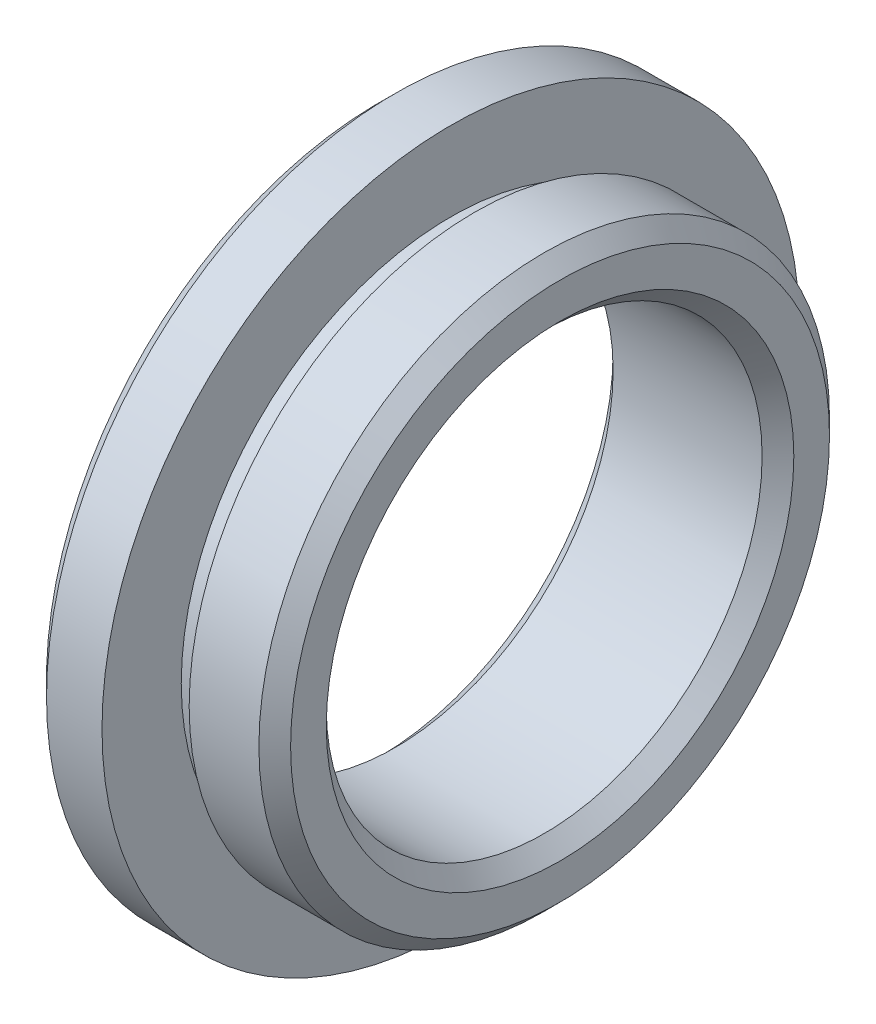
ISO-10303-21;
HEADER;
FILE_DESCRIPTION(('STEP AP214'),'2;1');
FILE_NAME('part.step','',(''),(''),'','','');
FILE_SCHEMA(('AUTOMOTIVE_DESIGN { 1 0 10303 214 1 1 1 1 }'));
ENDSEC;
DATA;
#1=APPLICATION_CONTEXT('core data for automotive mechanical design processes');
#2=APPLICATION_PROTOCOL_DEFINITION('international standard','automotive_design',2000,#1);
#3=PRODUCT_CONTEXT('',#1,'mechanical');
#4=PRODUCT('Part','Part','',(#3));
#5=PRODUCT_RELATED_PRODUCT_CATEGORY('part','',(#4));
#6=PRODUCT_DEFINITION_FORMATION('','',#4);
#7=PRODUCT_DEFINITION_CONTEXT('part definition',#1,'design');
#8=PRODUCT_DEFINITION('design','',#6,#7);
#9=PRODUCT_DEFINITION_SHAPE('','',#8);
#10=(LENGTH_UNIT() NAMED_UNIT(*) SI_UNIT(.MILLI.,.METRE.));
#11=(NAMED_UNIT(*) PLANE_ANGLE_UNIT() SI_UNIT($,.RADIAN.));
#12=(NAMED_UNIT(*) SI_UNIT($,.STERADIAN.) SOLID_ANGLE_UNIT());
#13=UNCERTAINTY_MEASURE_WITH_UNIT(LENGTH_MEASURE(1.E-05),#10,'distance_accuracy_value','');
#14=(GEOMETRIC_REPRESENTATION_CONTEXT(3) GLOBAL_UNCERTAINTY_ASSIGNED_CONTEXT((#13)) GLOBAL_UNIT_ASSIGNED_CONTEXT((#10,
#11,#12)) REPRESENTATION_CONTEXT('',''));
#15=CARTESIAN_POINT('',(0.,0.,0.));
#16=DIRECTION('',(0.,0.,1.));
#17=DIRECTION('',(1.,0.,0.));
#18=AXIS2_PLACEMENT_3D('',#15,#16,#17);
#19=CARTESIAN_POINT('',(0.,0.,0.));
#20=DIRECTION('',(-1.,0.,0.));
#21=DIRECTION('',(0.,0.,1.));
#22=AXIS2_PLACEMENT_3D('',#19,#20,#21);
#23=CYLINDRICAL_SURFACE('',#22,13.75);
#24=CARTESIAN_POINT('',(1.00000000000001,0.,0.));
#25=DIRECTION('',(1.,0.,0.));
#26=DIRECTION('',(0.,0.,-1.));
#27=AXIS2_PLACEMENT_3D('',#24,#25,#26);
#28=CIRCLE('',#27,13.75);
#29=CARTESIAN_POINT('',(1.00000000000001,0.,-13.75));
#30=VERTEX_POINT('',#29);
#31=EDGE_CURVE('E79',#30,#30,#28,.F.);
#32=ORIENTED_EDGE('',*,*,#31,.T.);
#33=EDGE_LOOP('',(#32));
#34=FACE_BOUND('',#33,.T.);
#35=CARTESIAN_POINT('',(10.4,0.,0.));
#36=DIRECTION('',(-1.,0.,0.));
#37=DIRECTION('',(0.,0.,1.));
#38=AXIS2_PLACEMENT_3D('',#35,#36,#37);
#39=CIRCLE('',#38,13.75);
#40=CARTESIAN_POINT('',(10.4,0.,13.75));
#41=VERTEX_POINT('',#40);
#42=EDGE_CURVE('E76',#41,#41,#39,.F.);
#43=ORIENTED_EDGE('',*,*,#42,.T.);
#44=EDGE_LOOP('',(#43));
#45=FACE_BOUND('',#44,.T.);
#46=ADVANCED_FACE('F31',(#34,#45),#23,.F.);
#47=CARTESIAN_POINT('',(0.,13.75,0.));
#48=DIRECTION('',(1.,0.,0.));
#49=DIRECTION('',(0.,0.,-1.));
#50=AXIS2_PLACEMENT_3D('',#47,#48,#49);
#51=PLANE('',#50);
#52=CARTESIAN_POINT('',(0.,-18.5,0.));
#53=DIRECTION('',(-1.,0.,0.));
#54=DIRECTION('',(0.,0.,1.));
#55=AXIS2_PLACEMENT_3D('',#52,#53,#54);
#56=CIRCLE('',#55,1.55);
#57=CARTESIAN_POINT('',(0.,-18.5,1.55));
#58=VERTEX_POINT('',#57);
#59=EDGE_CURVE('E53',#58,#58,#56,.T.);
#60=ORIENTED_EDGE('',*,*,#59,.F.);
#61=EDGE_LOOP('',(#60));
#62=FACE_BOUND('',#61,.T.);
#63=CARTESIAN_POINT('',(0.,18.5,0.));
#64=DIRECTION('',(-1.,0.,0.));
#65=DIRECTION('',(0.,0.,1.));
#66=AXIS2_PLACEMENT_3D('',#63,#64,#65);
#67=CIRCLE('',#66,1.55);
#68=CARTESIAN_POINT('',(0.,18.5,1.55));
#69=VERTEX_POINT('',#68);
#70=EDGE_CURVE('E61',#69,#69,#67,.T.);
#71=ORIENTED_EDGE('',*,*,#70,.F.);
#72=EDGE_LOOP('',(#71));
#73=FACE_BOUND('',#72,.T.);
#74=CARTESIAN_POINT('',(0.,0.,0.));
#75=DIRECTION('',(1.,0.,0.));
#76=DIRECTION('',(0.,0.,-1.));
#77=AXIS2_PLACEMENT_3D('',#74,#75,#76);
#78=CIRCLE('',#77,14.75);
#79=CARTESIAN_POINT('',(0.,0.,-14.75));
#80=VERTEX_POINT('',#79);
#81=EDGE_CURVE('E85',#80,#80,#78,.T.);
#82=ORIENTED_EDGE('',*,*,#81,.T.);
#83=EDGE_LOOP('',(#82));
#84=FACE_BOUND('',#83,.T.);
#85=CARTESIAN_POINT('',(0.,0.,0.));
#86=DIRECTION('',(1.,0.,0.));
#87=DIRECTION('',(0.,0.,-1.));
#88=AXIS2_PLACEMENT_3D('',#85,#86,#87);
#89=CIRCLE('',#88,21.);
#90=CARTESIAN_POINT('',(0.,0.,-21.));
#91=VERTEX_POINT('',#90);
#92=EDGE_CURVE('E82',#91,#91,#89,.F.);
#93=ORIENTED_EDGE('',*,*,#92,.T.);
#94=EDGE_LOOP('',(#93));
#95=FACE_BOUND('',#94,.T.);
#96=ADVANCED_FACE('F107',(#62,#73,#84,#95),#51,.F.);
#97=CARTESIAN_POINT('',(0.,0.,0.));
#98=DIRECTION('',(-1.,0.,0.));
#99=DIRECTION('',(0.,0.,1.));
#100=AXIS2_PLACEMENT_3D('',#97,#98,#99);
#101=CYLINDRICAL_SURFACE('',#100,22.);
#102=CARTESIAN_POINT('',(1.,0.,0.));
#103=DIRECTION('',(1.,0.,0.));
#104=DIRECTION('',(0.,0.,-1.));
#105=AXIS2_PLACEMENT_3D('',#102,#103,#104);
#106=CIRCLE('',#105,22.);
#107=CARTESIAN_POINT('',(1.,0.,-22.));
#108=VERTEX_POINT('',#107);
#109=EDGE_CURVE('E38',#108,#108,#106,.T.);
#110=ORIENTED_EDGE('',*,*,#109,.T.);
#111=EDGE_LOOP('',(#110));
#112=FACE_BOUND('',#111,.T.);
#113=CARTESIAN_POINT('',(4.5,0.,0.));
#114=DIRECTION('',(-1.,0.,0.));
#115=DIRECTION('',(0.,0.,1.));
#116=AXIS2_PLACEMENT_3D('',#113,#114,#115);
#117=CIRCLE('',#116,22.);
#118=CARTESIAN_POINT('',(4.5,0.,22.));
#119=VERTEX_POINT('',#118);
#120=EDGE_CURVE('E73',#119,#119,#117,.T.);
#121=ORIENTED_EDGE('',*,*,#120,.T.);
#122=EDGE_LOOP('',(#121));
#123=FACE_BOUND('',#122,.T.);
#124=ADVANCED_FACE('F96',(#112,#123),#101,.T.);
#125=CARTESIAN_POINT('',(4.5,22.,0.));
#126=DIRECTION('',(-1.,0.,0.));
#127=DIRECTION('',(0.,0.,1.));
#128=AXIS2_PLACEMENT_3D('',#125,#126,#127);
#129=PLANE('',#128);
#130=ORIENTED_EDGE('',*,*,#120,.F.);
#131=EDGE_LOOP('',(#130));
#132=FACE_BOUND('',#131,.T.);
#133=CARTESIAN_POINT('',(4.5,0.,0.));
#134=DIRECTION('',(-1.,0.,0.));
#135=DIRECTION('',(0.,0.,1.));
#136=AXIS2_PLACEMENT_3D('',#133,#134,#135);
#137=CIRCLE('',#136,17.);
#138=CARTESIAN_POINT('',(4.5,0.,17.));
#139=VERTEX_POINT('',#138);
#140=EDGE_CURVE('E70',#139,#139,#137,.T.);
#141=ORIENTED_EDGE('',*,*,#140,.T.);
#142=EDGE_LOOP('',(#141));
#143=FACE_BOUND('',#142,.T.);
#144=ADVANCED_FACE('F114',(#132,#143),#129,.F.);
#145=CARTESIAN_POINT('',(0.,0.,0.));
#146=DIRECTION('',(-1.,0.,0.));
#147=DIRECTION('',(0.,0.,1.));
#148=AXIS2_PLACEMENT_3D('',#145,#146,#147);
#149=CYLINDRICAL_SURFACE('',#148,17.);
#150=ORIENTED_EDGE('',*,*,#140,.F.);
#151=EDGE_LOOP('',(#150));
#152=FACE_BOUND('',#151,.T.);
#153=CARTESIAN_POINT('',(6.,0.,0.));
#154=DIRECTION('',(-1.,0.,0.));
#155=DIRECTION('',(0.,0.,1.));
#156=AXIS2_PLACEMENT_3D('',#153,#154,#155);
#157=CIRCLE('',#156,17.);
#158=CARTESIAN_POINT('',(6.,0.,17.));
#159=VERTEX_POINT('',#158);
#160=EDGE_CURVE('E67',#159,#159,#157,.T.);
#161=ORIENTED_EDGE('',*,*,#160,.T.);
#162=EDGE_LOOP('',(#161));
#163=FACE_BOUND('',#162,.T.);
#164=ADVANCED_FACE('F122',(#152,#163),#149,.T.);
#165=CARTESIAN_POINT('',(6.,17.,0.));
#166=DIRECTION('',(1.,0.,0.));
#167=DIRECTION('',(0.,0.,-1.));
#168=AXIS2_PLACEMENT_3D('',#165,#166,#167);
#169=PLANE('',#168);
#170=ORIENTED_EDGE('',*,*,#160,.F.);
#171=EDGE_LOOP('',(#170));
#172=FACE_BOUND('',#171,.T.);
#173=CARTESIAN_POINT('',(6.,0.,0.));
#174=DIRECTION('',(-1.,0.,0.));
#175=DIRECTION('',(0.,0.,1.));
#176=AXIS2_PLACEMENT_3D('',#173,#174,#175);
#177=CIRCLE('',#176,18.);
#178=CARTESIAN_POINT('',(6.,0.,18.));
#179=VERTEX_POINT('',#178);
#180=EDGE_CURVE('E64',#179,#179,#177,.T.);
#181=ORIENTED_EDGE('',*,*,#180,.T.);
#182=EDGE_LOOP('',(#181));
#183=FACE_BOUND('',#182,.T.);
#184=ADVANCED_FACE('F126',(#172,#183),#169,.F.);
#185=CARTESIAN_POINT('',(0.,0.,0.));
#186=DIRECTION('',(-1.,0.,0.));
#187=DIRECTION('',(0.,0.,1.));
#188=AXIS2_PLACEMENT_3D('',#185,#186,#187);
#189=CYLINDRICAL_SURFACE('',#188,18.);
#190=CARTESIAN_POINT('',(10.4,0.,0.));
#191=DIRECTION('',(-1.,0.,0.));
#192=DIRECTION('',(0.,0.,1.));
#193=AXIS2_PLACEMENT_3D('',#190,#191,#192);
#194=CIRCLE('',#193,18.);
#195=CARTESIAN_POINT('',(10.4,0.,18.));
#196=VERTEX_POINT('',#195);
#197=EDGE_CURVE('E11',#196,#196,#194,.T.);
#198=ORIENTED_EDGE('',*,*,#197,.T.);
#199=EDGE_LOOP('',(#198));
#200=FACE_BOUND('',#199,.T.);
#201=ORIENTED_EDGE('',*,*,#180,.F.);
#202=EDGE_LOOP('',(#201));
#203=FACE_BOUND('',#202,.T.);
#204=ADVANCED_FACE('F130',(#200,#203),#189,.T.);
#205=CARTESIAN_POINT('',(11.4,18.,0.));
#206=DIRECTION('',(-1.,0.,0.));
#207=DIRECTION('',(0.,0.,1.));
#208=AXIS2_PLACEMENT_3D('',#205,#206,#207);
#209=PLANE('',#208);
#210=CARTESIAN_POINT('',(11.4,0.,0.));
#211=DIRECTION('',(-1.,0.,0.));
#212=DIRECTION('',(0.,0.,1.));
#213=AXIS2_PLACEMENT_3D('',#210,#211,#212);
#214=CIRCLE('',#213,14.75);
#215=CARTESIAN_POINT('',(11.4,0.,14.75));
#216=VERTEX_POINT('',#215);
#217=EDGE_CURVE('E91',#216,#216,#214,.T.);
#218=ORIENTED_EDGE('',*,*,#217,.T.);
#219=EDGE_LOOP('',(#218));
#220=FACE_BOUND('',#219,.T.);
#221=CARTESIAN_POINT('',(11.4,0.,0.));
#222=DIRECTION('',(-1.,0.,0.));
#223=DIRECTION('',(0.,0.,1.));
#224=AXIS2_PLACEMENT_3D('',#221,#222,#223);
#225=CIRCLE('',#224,17.);
#226=CARTESIAN_POINT('',(11.4,0.,17.));
#227=VERTEX_POINT('',#226);
#228=EDGE_CURVE('E88',#227,#227,#225,.F.);
#229=ORIENTED_EDGE('',*,*,#228,.T.);
#230=EDGE_LOOP('',(#229));
#231=FACE_BOUND('',#230,.T.);
#232=ADVANCED_FACE('F134',(#220,#231),#209,.F.);
#233=CARTESIAN_POINT('',(1.00000000000001,0.,0.));
#234=DIRECTION('',(-1.,0.,0.));
#235=DIRECTION('',(0.,0.,1.));
#236=AXIS2_PLACEMENT_3D('',#233,#234,#235);
#237=CONICAL_SURFACE('',#236,13.75,0.785398163397447);
#238=ORIENTED_EDGE('',*,*,#81,.F.);
#239=EDGE_LOOP('',(#238));
#240=FACE_BOUND('',#239,.T.);
#241=ORIENTED_EDGE('',*,*,#31,.F.);
#242=EDGE_LOOP('',(#241));
#243=FACE_BOUND('',#242,.T.);
#244=ADVANCED_FACE('F138',(#240,#243),#237,.F.);
#245=CARTESIAN_POINT('',(11.4,0.,0.));
#246=DIRECTION('',(1.,0.,0.));
#247=DIRECTION('',(0.,0.,-1.));
#248=AXIS2_PLACEMENT_3D('',#245,#246,#247);
#249=CONICAL_SURFACE('',#248,14.75,0.785398163397445);
#250=ORIENTED_EDGE('',*,*,#42,.F.);
#251=EDGE_LOOP('',(#250));
#252=FACE_BOUND('',#251,.T.);
#253=ORIENTED_EDGE('',*,*,#217,.F.);
#254=EDGE_LOOP('',(#253));
#255=FACE_BOUND('',#254,.T.);
#256=ADVANCED_FACE('F103',(#252,#255),#249,.F.);
#257=CARTESIAN_POINT('',(0.,0.,0.));
#258=DIRECTION('',(1.,0.,0.));
#259=DIRECTION('',(0.,0.,-1.));
#260=AXIS2_PLACEMENT_3D('',#257,#258,#259);
#261=CONICAL_SURFACE('',#260,21.,0.785398163397447);
#262=ORIENTED_EDGE('',*,*,#109,.F.);
#263=EDGE_LOOP('',(#262));
#264=FACE_BOUND('',#263,.T.);
#265=ORIENTED_EDGE('',*,*,#92,.F.);
#266=EDGE_LOOP('',(#265));
#267=FACE_BOUND('',#266,.T.);
#268=ADVANCED_FACE('F99',(#264,#267),#261,.T.);
#269=CARTESIAN_POINT('',(10.4,0.,0.));
#270=DIRECTION('',(-1.,0.,0.));
#271=DIRECTION('',(0.,0.,1.));
#272=AXIS2_PLACEMENT_3D('',#269,#270,#271);
#273=CONICAL_SURFACE('',#272,18.,0.785398163397448);
#274=ORIENTED_EDGE('',*,*,#228,.F.);
#275=EDGE_LOOP('',(#274));
#276=FACE_BOUND('',#275,.T.);
#277=ORIENTED_EDGE('',*,*,#197,.F.);
#278=EDGE_LOOP('',(#277));
#279=FACE_BOUND('',#278,.T.);
#280=ADVANCED_FACE('F102',(#276,#279),#273,.T.);
#281=CARTESIAN_POINT('',(0.,18.5,0.));
#282=DIRECTION('',(-1.,0.,0.));
#283=DIRECTION('',(0.,0.,1.));
#284=AXIS2_PLACEMENT_3D('',#281,#282,#283);
#285=CYLINDRICAL_SURFACE('',#284,1.55);
#286=CARTESIAN_POINT('',(3.5,18.5,0.));
#287=DIRECTION('',(-1.,0.,0.));
#288=DIRECTION('',(0.,0.,1.));
#289=AXIS2_PLACEMENT_3D('',#286,#287,#288);
#290=CIRCLE('',#289,1.55);
#291=CARTESIAN_POINT('',(3.5,18.5,1.55));
#292=VERTEX_POINT('',#291);
#293=EDGE_CURVE('E56',#292,#292,#290,.T.);
#294=ORIENTED_EDGE('',*,*,#293,.F.);
#295=EDGE_LOOP('',(#294));
#296=FACE_BOUND('',#295,.T.);
#297=ORIENTED_EDGE('',*,*,#70,.T.);
#298=EDGE_LOOP('',(#297));
#299=FACE_BOUND('',#298,.T.);
#300=ADVANCED_FACE('F148',(#296,#299),#285,.F.);
#301=CARTESIAN_POINT('',(3.5,18.5,0.));
#302=DIRECTION('',(-1.,0.,0.));
#303=DIRECTION('',(0.,0.,1.));
#304=AXIS2_PLACEMENT_3D('',#301,#302,#303);
#305=CONICAL_SURFACE('',#304,1.55,1.02974425867665);
#306=CARTESIAN_POINT('',(4.43133395949272,18.5,0.));
#307=VERTEX_POINT('',#306);
#308=VERTEX_LOOP('',#307);
#309=FACE_BOUND('',#308,.T.);
#310=ORIENTED_EDGE('',*,*,#293,.T.);
#311=EDGE_LOOP('',(#310));
#312=FACE_BOUND('',#311,.T.);
#313=ADVANCED_FACE('F152',(#309,#312),#305,.F.);
#314=CARTESIAN_POINT('',(0.,-18.5,0.));
#315=DIRECTION('',(-1.,0.,0.));
#316=DIRECTION('',(0.,0.,1.));
#317=AXIS2_PLACEMENT_3D('',#314,#315,#316);
#318=CYLINDRICAL_SURFACE('',#317,1.55);
#319=CARTESIAN_POINT('',(3.5,-18.5,0.));
#320=DIRECTION('',(-1.,0.,0.));
#321=DIRECTION('',(0.,0.,1.));
#322=AXIS2_PLACEMENT_3D('',#319,#320,#321);
#323=CIRCLE('',#322,1.55);
#324=CARTESIAN_POINT('',(3.5,-18.5,1.55));
#325=VERTEX_POINT('',#324);
#326=EDGE_CURVE('E51',#325,#325,#323,.T.);
#327=ORIENTED_EDGE('',*,*,#326,.F.);
#328=EDGE_LOOP('',(#327));
#329=FACE_BOUND('',#328,.T.);
#330=ORIENTED_EDGE('',*,*,#59,.T.);
#331=EDGE_LOOP('',(#330));
#332=FACE_BOUND('',#331,.T.);
#333=ADVANCED_FACE('F47',(#329,#332),#318,.F.);
#334=CARTESIAN_POINT('',(3.5,-18.5,0.));
#335=DIRECTION('',(-1.,0.,0.));
#336=DIRECTION('',(0.,0.,1.));
#337=AXIS2_PLACEMENT_3D('',#334,#335,#336);
#338=CONICAL_SURFACE('',#337,1.55,1.02974425867665);
#339=CARTESIAN_POINT('',(4.43133395949272,-18.5,0.));
#340=VERTEX_POINT('',#339);
#341=VERTEX_LOOP('',#340);
#342=FACE_BOUND('',#341,.T.);
#343=ORIENTED_EDGE('',*,*,#326,.T.);
#344=EDGE_LOOP('',(#343));
#345=FACE_BOUND('',#344,.T.);
#346=ADVANCED_FACE('F44',(#342,#345),#338,.F.);
#347=CLOSED_SHELL('',(#46,#96,#124,#144,#164,#184,#204,#232,#244,#256,#268,#280,#300,#313,#333,#346));
#348=MANIFOLD_SOLID_BREP('B2',#347);
#349=ADVANCED_BREP_SHAPE_REPRESENTATION('',(#18,#348),#14);
#350=SHAPE_DEFINITION_REPRESENTATION(#9,#349);
ENDSEC;
END-ISO-10303-21;
